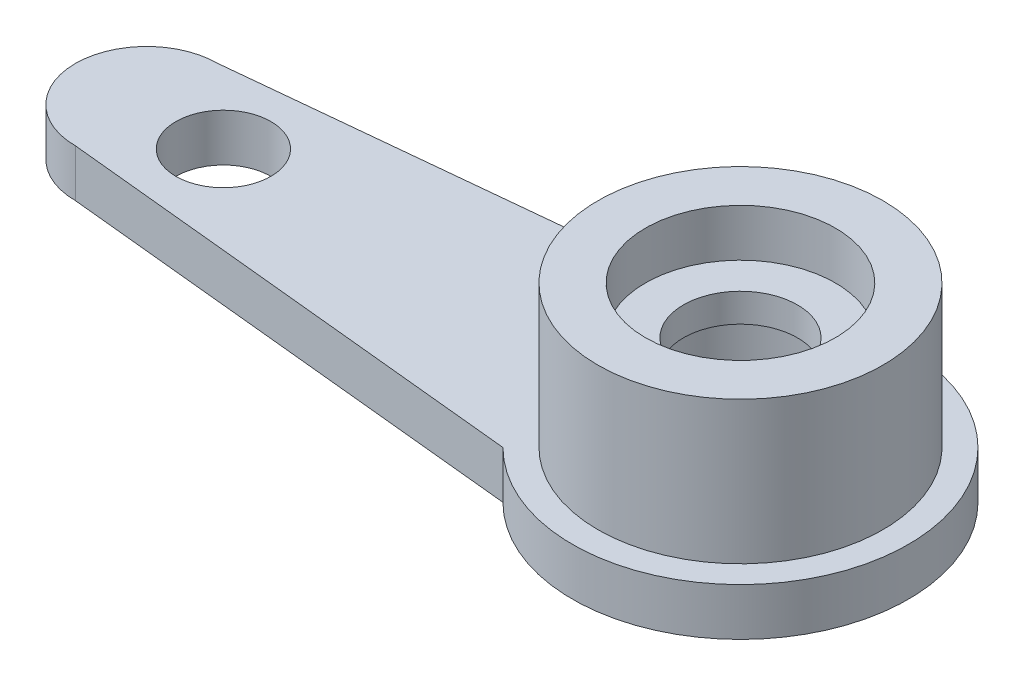
ISO-10303-21;
HEADER;
FILE_DESCRIPTION(('STEP AP214'),'2;1');
FILE_NAME('part.step','',(''),(''),'','','');
FILE_SCHEMA(('AUTOMOTIVE_DESIGN { 1 0 10303 214 1 1 1 1 }'));
ENDSEC;
DATA;
#1=APPLICATION_CONTEXT('core data for automotive mechanical design processes');
#2=APPLICATION_PROTOCOL_DEFINITION('international standard','automotive_design',2000,#1);
#3=PRODUCT_CONTEXT('',#1,'mechanical');
#4=PRODUCT('Part','Part','',(#3));
#5=PRODUCT_RELATED_PRODUCT_CATEGORY('part','',(#4));
#6=PRODUCT_DEFINITION_FORMATION('','',#4);
#7=PRODUCT_DEFINITION_CONTEXT('part definition',#1,'design');
#8=PRODUCT_DEFINITION('design','',#6,#7);
#9=PRODUCT_DEFINITION_SHAPE('','',#8);
#10=(LENGTH_UNIT() NAMED_UNIT(*) SI_UNIT(.MILLI.,.METRE.));
#11=(NAMED_UNIT(*) PLANE_ANGLE_UNIT() SI_UNIT($,.RADIAN.));
#12=(NAMED_UNIT(*) SI_UNIT($,.STERADIAN.) SOLID_ANGLE_UNIT());
#13=UNCERTAINTY_MEASURE_WITH_UNIT(LENGTH_MEASURE(1.E-05),#10,'distance_accuracy_value','');
#14=(GEOMETRIC_REPRESENTATION_CONTEXT(3) GLOBAL_UNCERTAINTY_ASSIGNED_CONTEXT((#13)) GLOBAL_UNIT_ASSIGNED_CONTEXT((#10,
#11,#12)) REPRESENTATION_CONTEXT('',''));
#15=CARTESIAN_POINT('',(0.,0.,0.));
#16=DIRECTION('',(0.,0.,1.));
#17=DIRECTION('',(1.,0.,0.));
#18=AXIS2_PLACEMENT_3D('',#15,#16,#17);
#19=CARTESIAN_POINT('',(0.,2.5,0.));
#20=DIRECTION('',(0.,-1.,0.));
#21=DIRECTION('',(0.,0.,-1.));
#22=AXIS2_PLACEMENT_3D('',#19,#20,#21);
#23=CYLINDRICAL_SURFACE('',#22,10.);
#24=CARTESIAN_POINT('',(0.,-2.5,0.));
#25=DIRECTION('',(0.,1.,0.));
#26=DIRECTION('',(0.,0.,1.));
#27=AXIS2_PLACEMENT_3D('',#24,#25,#26);
#28=CIRCLE('',#27,10.);
#29=CARTESIAN_POINT('',(0.,-2.5,10.));
#30=VERTEX_POINT('',#29);
#31=EDGE_CURVE('E107',#30,#30,#28,.T.);
#32=ORIENTED_EDGE('',*,*,#31,.F.);
#33=EDGE_LOOP('',(#32));
#34=FACE_BOUND('',#33,.T.);
#35=CARTESIAN_POINT('',(0.,9.5,0.));
#36=DIRECTION('',(0.,1.,0.));
#37=DIRECTION('',(0.,0.,1.));
#38=AXIS2_PLACEMENT_3D('',#35,#36,#37);
#39=CIRCLE('',#38,10.);
#40=CARTESIAN_POINT('',(0.,9.5,10.));
#41=VERTEX_POINT('',#40);
#42=EDGE_CURVE('E136',#41,#41,#39,.T.);
#43=ORIENTED_EDGE('',*,*,#42,.T.);
#44=EDGE_LOOP('',(#43));
#45=FACE_BOUND('',#44,.T.);
#46=ADVANCED_FACE('F36',(#34,#45),#23,.F.);
#47=CARTESIAN_POINT('',(0.,2.5,0.));
#48=DIRECTION('',(0.,-1.,0.));
#49=DIRECTION('',(0.,0.,-1.));
#50=AXIS2_PLACEMENT_3D('',#47,#48,#49);
#51=PLANE('',#50);
#52=CARTESIAN_POINT('',(-54.4172364445858,2.5,0.));
#53=DIRECTION('',(0.,1.,0.));
#54=DIRECTION('',(0.,0.,1.));
#55=AXIS2_PLACEMENT_3D('',#52,#53,#54);
#56=CIRCLE('',#55,5.);
#57=CARTESIAN_POINT('',(-54.4172364445858,2.5,5.));
#58=VERTEX_POINT('',#57);
#59=EDGE_CURVE('E132',#58,#58,#56,.T.);
#60=ORIENTED_EDGE('',*,*,#59,.F.);
#61=EDGE_LOOP('',(#60));
#62=FACE_BOUND('',#61,.T.);
#63=CARTESIAN_POINT('',(0.,2.5,0.));
#64=DIRECTION('',(0.,1.,0.));
#65=DIRECTION('',(0.,0.,1.));
#66=AXIS2_PLACEMENT_3D('',#63,#64,#65);
#67=CIRCLE('',#66,15.);
#68=CARTESIAN_POINT('',(0.,2.5,15.));
#69=VERTEX_POINT('',#68);
#70=EDGE_CURVE('E45',#69,#69,#67,.T.);
#71=ORIENTED_EDGE('',*,*,#70,.F.);
#72=EDGE_LOOP('',(#71));
#73=FACE_BOUND('',#72,.T.);
#74=CARTESIAN_POINT('',(0.,2.5,0.));
#75=DIRECTION('',(0.,1.,0.));
#76=DIRECTION('',(0.,0.,-1.));
#77=AXIS2_PLACEMENT_3D('',#74,#75,#76);
#78=CIRCLE('',#77,17.6776695296637);
#79=CARTESIAN_POINT('',(-12.5,2.5,12.5));
#80=VERTEX_POINT('',#79);
#81=CARTESIAN_POINT('',(-12.5,2.5,-12.5));
#82=VERTEX_POINT('',#81);
#83=EDGE_CURVE('E89',#80,#82,#78,.T.);
#84=ORIENTED_EDGE('',*,*,#83,.T.);
#85=DIRECTION('',(-0.995037190209989,0.,0.099503719020999));
#86=VECTOR('',#85,1.);
#87=CARTESIAN_POINT('',(-12.5,2.5,-12.5));
#88=LINE('',#87,#86);
#89=CARTESIAN_POINT('',(-62.5,2.5,-7.5));
#90=VERTEX_POINT('',#89);
#91=EDGE_CURVE('E84',#82,#90,#88,.T.);
#92=ORIENTED_EDGE('',*,*,#91,.T.);
#93=CARTESIAN_POINT('',(-62.5,2.5,0.));
#94=DIRECTION('',(0.,1.,0.));
#95=DIRECTION('',(0.,0.,-1.));
#96=AXIS2_PLACEMENT_3D('',#93,#94,#95);
#97=CIRCLE('',#96,7.5);
#98=CARTESIAN_POINT('',(-62.5,2.5,7.5));
#99=VERTEX_POINT('',#98);
#100=EDGE_CURVE('E87',#90,#99,#97,.T.);
#101=ORIENTED_EDGE('',*,*,#100,.T.);
#102=DIRECTION('',(0.995037190209989,0.,0.099503719020999));
#103=VECTOR('',#102,1.);
#104=CARTESIAN_POINT('',(-62.5,2.5,7.5));
#105=LINE('',#104,#103);
#106=EDGE_CURVE('E53',#99,#80,#105,.T.);
#107=ORIENTED_EDGE('',*,*,#106,.T.);
#108=EDGE_LOOP('',(#84,#92,#101,#107));
#109=FACE_BOUND('',#108,.T.);
#110=ADVANCED_FACE('F85',(#62,#73,#109),#51,.F.);
#111=CARTESIAN_POINT('',(0.,-2.5,0.));
#112=DIRECTION('',(0.,-1.,0.));
#113=DIRECTION('',(0.,0.,-1.));
#114=AXIS2_PLACEMENT_3D('',#111,#112,#113);
#115=PLANE('',#114);
#116=CARTESIAN_POINT('',(-54.4172364445858,-2.5,0.));
#117=DIRECTION('',(0.,1.,0.));
#118=DIRECTION('',(0.,0.,1.));
#119=AXIS2_PLACEMENT_3D('',#116,#117,#118);
#120=CIRCLE('',#119,5.);
#121=CARTESIAN_POINT('',(-54.4172364445858,-2.5,5.));
#122=VERTEX_POINT('',#121);
#123=EDGE_CURVE('E128',#122,#122,#120,.T.);
#124=ORIENTED_EDGE('',*,*,#123,.T.);
#125=EDGE_LOOP('',(#124));
#126=FACE_BOUND('',#125,.T.);
#127=CARTESIAN_POINT('',(0.,-2.5,0.));
#128=DIRECTION('',(0.,1.,0.));
#129=DIRECTION('',(0.,0.,-1.));
#130=AXIS2_PLACEMENT_3D('',#127,#128,#129);
#131=CIRCLE('',#130,17.6776695296637);
#132=CARTESIAN_POINT('',(-12.5,-2.5,12.5));
#133=VERTEX_POINT('',#132);
#134=CARTESIAN_POINT('',(-12.5,-2.5,-12.5));
#135=VERTEX_POINT('',#134);
#136=EDGE_CURVE('E104',#133,#135,#131,.T.);
#137=ORIENTED_EDGE('',*,*,#136,.F.);
#138=DIRECTION('',(0.995037190209989,0.,0.099503719020999));
#139=VECTOR('',#138,1.);
#140=CARTESIAN_POINT('',(-62.5,-2.5,7.5));
#141=LINE('',#140,#139);
#142=CARTESIAN_POINT('',(-62.5,-2.5,7.5));
#143=VERTEX_POINT('',#142);
#144=EDGE_CURVE('E76',#143,#133,#141,.T.);
#145=ORIENTED_EDGE('',*,*,#144,.F.);
#146=CARTESIAN_POINT('',(-62.5,-2.5,0.));
#147=DIRECTION('',(0.,1.,0.));
#148=DIRECTION('',(0.,0.,-1.));
#149=AXIS2_PLACEMENT_3D('',#146,#147,#148);
#150=CIRCLE('',#149,7.5);
#151=CARTESIAN_POINT('',(-62.5,-2.5,-7.5));
#152=VERTEX_POINT('',#151);
#153=EDGE_CURVE('E70',#152,#143,#150,.T.);
#154=ORIENTED_EDGE('',*,*,#153,.F.);
#155=DIRECTION('',(-0.995037190209989,0.,0.099503719020999));
#156=VECTOR('',#155,1.);
#157=CARTESIAN_POINT('',(-12.5,-2.5,-12.5));
#158=LINE('',#157,#156);
#159=EDGE_CURVE('E94',#135,#152,#158,.T.);
#160=ORIENTED_EDGE('',*,*,#159,.F.);
#161=EDGE_LOOP('',(#137,#145,#154,#160));
#162=FACE_BOUND('',#161,.T.);
#163=ORIENTED_EDGE('',*,*,#31,.T.);
#164=EDGE_LOOP('',(#163));
#165=FACE_BOUND('',#164,.T.);
#166=ADVANCED_FACE('F173',(#126,#162,#165),#115,.T.);
#167=CARTESIAN_POINT('',(0.,2.5,0.));
#168=DIRECTION('',(0.,-1.,0.));
#169=DIRECTION('',(0.,0.,-1.));
#170=AXIS2_PLACEMENT_3D('',#167,#168,#169);
#171=CYLINDRICAL_SURFACE('',#170,17.6776695296637);
#172=ORIENTED_EDGE('',*,*,#136,.T.);
#173=DIRECTION('',(0.,-1.,0.));
#174=VECTOR('',#173,1.);
#175=CARTESIAN_POINT('',(-12.5,2.5,-12.5));
#176=LINE('',#175,#174);
#177=EDGE_CURVE('E95',#82,#135,#176,.T.);
#178=ORIENTED_EDGE('',*,*,#177,.F.);
#179=ORIENTED_EDGE('',*,*,#83,.F.);
#180=DIRECTION('',(0.,-1.,0.));
#181=VECTOR('',#180,1.);
#182=CARTESIAN_POINT('',(-12.5,2.5,12.5));
#183=LINE('',#182,#181);
#184=EDGE_CURVE('E100',#80,#133,#183,.T.);
#185=ORIENTED_EDGE('',*,*,#184,.T.);
#186=EDGE_LOOP('',(#172,#178,#179,#185));
#187=FACE_BOUND('',#186,.T.);
#188=ADVANCED_FACE('F38',(#187),#171,.T.);
#189=CARTESIAN_POINT('',(-12.5,2.5,-12.5));
#190=DIRECTION('',(0.099503719020999,0.,0.995037190209989));
#191=DIRECTION('',(0.995037190209989,0.,-0.099503719020999));
#192=AXIS2_PLACEMENT_3D('',#189,#190,#191);
#193=PLANE('',#192);
#194=ORIENTED_EDGE('',*,*,#159,.T.);
#195=DIRECTION('',(0.,-1.,0.));
#196=VECTOR('',#195,1.);
#197=CARTESIAN_POINT('',(-62.5,2.5,-7.5));
#198=LINE('',#197,#196);
#199=EDGE_CURVE('E92',#90,#152,#198,.T.);
#200=ORIENTED_EDGE('',*,*,#199,.F.);
#201=ORIENTED_EDGE('',*,*,#91,.F.);
#202=ORIENTED_EDGE('',*,*,#177,.T.);
#203=EDGE_LOOP('',(#194,#200,#201,#202));
#204=FACE_BOUND('',#203,.T.);
#205=ADVANCED_FACE('F93',(#204),#193,.F.);
#206=CARTESIAN_POINT('',(-62.5,2.5,0.));
#207=DIRECTION('',(0.,-1.,0.));
#208=DIRECTION('',(0.,0.,-1.));
#209=AXIS2_PLACEMENT_3D('',#206,#207,#208);
#210=CYLINDRICAL_SURFACE('',#209,7.5);
#211=ORIENTED_EDGE('',*,*,#153,.T.);
#212=DIRECTION('',(0.,-1.,0.));
#213=VECTOR('',#212,1.);
#214=CARTESIAN_POINT('',(-62.5,2.5,7.5));
#215=LINE('',#214,#213);
#216=EDGE_CURVE('E96',#99,#143,#215,.T.);
#217=ORIENTED_EDGE('',*,*,#216,.F.);
#218=ORIENTED_EDGE('',*,*,#100,.F.);
#219=ORIENTED_EDGE('',*,*,#199,.T.);
#220=EDGE_LOOP('',(#211,#217,#218,#219));
#221=FACE_BOUND('',#220,.T.);
#222=ADVANCED_FACE('F98',(#221),#210,.T.);
#223=CARTESIAN_POINT('',(-62.5,2.5,7.5));
#224=DIRECTION('',(0.099503719020999,0.,-0.995037190209989));
#225=DIRECTION('',(-0.995037190209989,0.,-0.099503719020999));
#226=AXIS2_PLACEMENT_3D('',#223,#224,#225);
#227=PLANE('',#226);
#228=ORIENTED_EDGE('',*,*,#144,.T.);
#229=ORIENTED_EDGE('',*,*,#184,.F.);
#230=ORIENTED_EDGE('',*,*,#106,.F.);
#231=ORIENTED_EDGE('',*,*,#216,.T.);
#232=EDGE_LOOP('',(#228,#229,#230,#231));
#233=FACE_BOUND('',#232,.T.);
#234=ADVANCED_FACE('F180',(#233),#227,.F.);
#235=CARTESIAN_POINT('',(0.,12.5,0.));
#236=DIRECTION('',(0.,1.,0.));
#237=DIRECTION('',(0.,0.,1.));
#238=AXIS2_PLACEMENT_3D('',#235,#236,#237);
#239=CIRCLE('',#238,10.);
#240=CARTESIAN_POINT('',(0.,12.5,10.));
#241=VERTEX_POINT('',#240);
#242=EDGE_CURVE('E11',#241,#241,#239,.T.);
#243=ORIENTED_EDGE('',*,*,#242,.F.);
#244=EDGE_LOOP('',(#243));
#245=FACE_BOUND('',#244,.T.);
#246=CARTESIAN_POINT('',(0.,17.5,0.));
#247=DIRECTION('',(0.,1.,0.));
#248=DIRECTION('',(0.,0.,1.));
#249=AXIS2_PLACEMENT_3D('',#246,#247,#248);
#250=CIRCLE('',#249,10.);
#251=CARTESIAN_POINT('',(0.,17.5,10.));
#252=VERTEX_POINT('',#251);
#253=EDGE_CURVE('E124',#252,#252,#250,.T.);
#254=ORIENTED_EDGE('',*,*,#253,.T.);
#255=EDGE_LOOP('',(#254));
#256=FACE_BOUND('',#255,.T.);
#257=ADVANCED_FACE('F169',(#245,#256),#23,.F.);
#258=CARTESIAN_POINT('',(0.,17.5,0.));
#259=DIRECTION('',(0.,1.,0.));
#260=DIRECTION('',(0.,0.,1.));
#261=AXIS2_PLACEMENT_3D('',#258,#259,#260);
#262=PLANE('',#261);
#263=CARTESIAN_POINT('',(0.,17.5,0.));
#264=DIRECTION('',(0.,1.,0.));
#265=DIRECTION('',(0.,0.,1.));
#266=AXIS2_PLACEMENT_3D('',#263,#264,#265);
#267=CIRCLE('',#266,15.);
#268=CARTESIAN_POINT('',(0.,17.5,15.));
#269=VERTEX_POINT('',#268);
#270=EDGE_CURVE('E118',#269,#269,#267,.T.);
#271=ORIENTED_EDGE('',*,*,#270,.T.);
#272=EDGE_LOOP('',(#271));
#273=FACE_BOUND('',#272,.T.);
#274=ORIENTED_EDGE('',*,*,#253,.F.);
#275=EDGE_LOOP('',(#274));
#276=FACE_BOUND('',#275,.T.);
#277=ADVANCED_FACE('F179',(#273,#276),#262,.T.);
#278=CARTESIAN_POINT('',(0.,17.5,0.));
#279=DIRECTION('',(0.,-1.,0.));
#280=DIRECTION('',(0.,0.,-1.));
#281=AXIS2_PLACEMENT_3D('',#278,#279,#280);
#282=CYLINDRICAL_SURFACE('',#281,15.);
#283=ORIENTED_EDGE('',*,*,#270,.F.);
#284=EDGE_LOOP('',(#283));
#285=FACE_BOUND('',#284,.T.);
#286=ORIENTED_EDGE('',*,*,#70,.T.);
#287=EDGE_LOOP('',(#286));
#288=FACE_BOUND('',#287,.T.);
#289=ADVANCED_FACE('F162',(#285,#288),#282,.T.);
#290=CARTESIAN_POINT('',(-54.4172364445858,-2.5,0.));
#291=DIRECTION('',(0.,1.,0.));
#292=DIRECTION('',(0.,0.,1.));
#293=AXIS2_PLACEMENT_3D('',#290,#291,#292);
#294=CYLINDRICAL_SURFACE('',#293,5.);
#295=ORIENTED_EDGE('',*,*,#123,.F.);
#296=EDGE_LOOP('',(#295));
#297=FACE_BOUND('',#296,.T.);
#298=ORIENTED_EDGE('',*,*,#59,.T.);
#299=EDGE_LOOP('',(#298));
#300=FACE_BOUND('',#299,.T.);
#301=ADVANCED_FACE('F153',(#297,#300),#294,.F.);
#302=CARTESIAN_POINT('',(0.,12.5,0.));
#303=DIRECTION('',(0.,1.,0.));
#304=DIRECTION('',(0.,0.,1.));
#305=AXIS2_PLACEMENT_3D('',#302,#303,#304);
#306=PLANE('',#305);
#307=ORIENTED_EDGE('',*,*,#242,.T.);
#308=EDGE_LOOP('',(#307));
#309=FACE_BOUND('',#308,.T.);
#310=CARTESIAN_POINT('',(0.,12.5,0.));
#311=DIRECTION('',(0.,1.,0.));
#312=DIRECTION('',(0.,0.,1.));
#313=AXIS2_PLACEMENT_3D('',#310,#311,#312);
#314=CIRCLE('',#313,6.);
#315=CARTESIAN_POINT('',(0.,12.5,6.));
#316=VERTEX_POINT('',#315);
#317=EDGE_CURVE('E140',#316,#316,#314,.T.);
#318=ORIENTED_EDGE('',*,*,#317,.F.);
#319=EDGE_LOOP('',(#318));
#320=FACE_BOUND('',#319,.T.);
#321=ADVANCED_FACE('F150',(#309,#320),#306,.T.);
#322=CARTESIAN_POINT('',(0.,9.5,0.));
#323=DIRECTION('',(0.,1.,0.));
#324=DIRECTION('',(0.,0.,1.));
#325=AXIS2_PLACEMENT_3D('',#322,#323,#324);
#326=PLANE('',#325);
#327=ORIENTED_EDGE('',*,*,#42,.F.);
#328=EDGE_LOOP('',(#327));
#329=FACE_BOUND('',#328,.T.);
#330=CARTESIAN_POINT('',(0.,9.5,0.));
#331=DIRECTION('',(0.,1.,0.));
#332=DIRECTION('',(0.,0.,1.));
#333=AXIS2_PLACEMENT_3D('',#330,#331,#332);
#334=CIRCLE('',#333,6.);
#335=CARTESIAN_POINT('',(0.,9.5,6.));
#336=VERTEX_POINT('',#335);
#337=EDGE_CURVE('E141',#336,#336,#334,.T.);
#338=ORIENTED_EDGE('',*,*,#337,.T.);
#339=EDGE_LOOP('',(#338));
#340=FACE_BOUND('',#339,.T.);
#341=ADVANCED_FACE('F152',(#329,#340),#326,.F.);
#342=CARTESIAN_POINT('',(0.,12.5,0.));
#343=DIRECTION('',(0.,-1.,0.));
#344=DIRECTION('',(0.,0.,-1.));
#345=AXIS2_PLACEMENT_3D('',#342,#343,#344);
#346=CYLINDRICAL_SURFACE('',#345,6.);
#347=ORIENTED_EDGE('',*,*,#317,.T.);
#348=EDGE_LOOP('',(#347));
#349=FACE_BOUND('',#348,.T.);
#350=ORIENTED_EDGE('',*,*,#337,.F.);
#351=EDGE_LOOP('',(#350));
#352=FACE_BOUND('',#351,.T.);
#353=ADVANCED_FACE('F147',(#349,#352),#346,.F.);
#354=CLOSED_SHELL('',(#46,#110,#166,#188,#205,#222,#234,#257,#277,#289,#301,#321,#341,#353));
#355=MANIFOLD_SOLID_BREP('B2',#354);
#356=ADVANCED_BREP_SHAPE_REPRESENTATION('',(#18,#355),#14);
#357=SHAPE_DEFINITION_REPRESENTATION(#9,#356);
ENDSEC;
END-ISO-10303-21;
